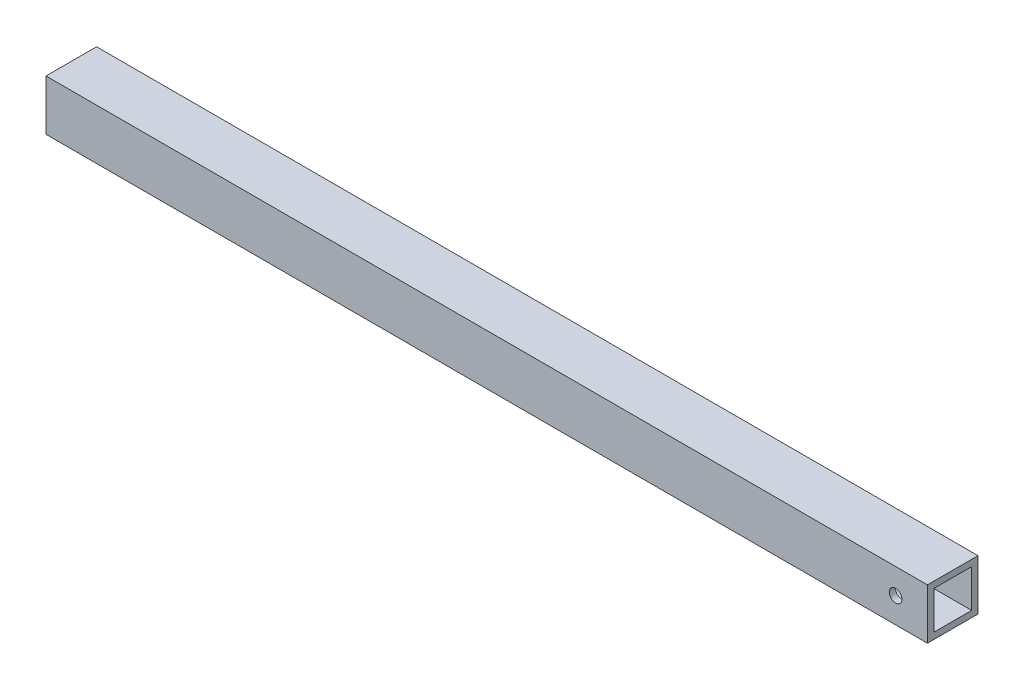
ISO-10303-21;
HEADER;
FILE_DESCRIPTION(('STEP AP214'),'2;1');
FILE_NAME('part.step','',(''),(''),'','','');
FILE_SCHEMA(('AUTOMOTIVE_DESIGN { 1 0 10303 214 1 1 1 1 }'));
ENDSEC;
DATA;
#1=APPLICATION_CONTEXT('core data for automotive mechanical design processes');
#2=APPLICATION_PROTOCOL_DEFINITION('international standard','automotive_design',2000,#1);
#3=PRODUCT_CONTEXT('',#1,'mechanical');
#4=PRODUCT('Part','Part','',(#3));
#5=PRODUCT_RELATED_PRODUCT_CATEGORY('part','',(#4));
#6=PRODUCT_DEFINITION_FORMATION('','',#4);
#7=PRODUCT_DEFINITION_CONTEXT('part definition',#1,'design');
#8=PRODUCT_DEFINITION('design','',#6,#7);
#9=PRODUCT_DEFINITION_SHAPE('','',#8);
#10=(LENGTH_UNIT() NAMED_UNIT(*) SI_UNIT(.MILLI.,.METRE.));
#11=(NAMED_UNIT(*) PLANE_ANGLE_UNIT() SI_UNIT($,.RADIAN.));
#12=(NAMED_UNIT(*) SI_UNIT($,.STERADIAN.) SOLID_ANGLE_UNIT());
#13=UNCERTAINTY_MEASURE_WITH_UNIT(LENGTH_MEASURE(1.E-05),#10,'distance_accuracy_value','');
#14=(GEOMETRIC_REPRESENTATION_CONTEXT(3) GLOBAL_UNCERTAINTY_ASSIGNED_CONTEXT((#13)) GLOBAL_UNIT_ASSIGNED_CONTEXT((#10,
#11,#12)) REPRESENTATION_CONTEXT('',''));
#15=CARTESIAN_POINT('',(0.,0.,0.));
#16=DIRECTION('',(0.,0.,1.));
#17=DIRECTION('',(1.,0.,0.));
#18=AXIS2_PLACEMENT_3D('',#15,#16,#17);
#19=CARTESIAN_POINT('',(-467.2,0.,-6.35));
#20=DIRECTION('',(0.,0.,1.));
#21=DIRECTION('',(0.,-1.,0.));
#22=AXIS2_PLACEMENT_3D('',#19,#20,#21);
#23=PLANE('',#22);
#24=CARTESIAN_POINT('',(-253.799125028571,3.79750000000007,-6.35));
#25=DIRECTION('',(0.,0.,1.));
#26=DIRECTION('',(0.,-1.,0.));
#27=AXIS2_PLACEMENT_3D('',#24,#25,#26);
#28=CIRCLE('',#27,1.59999999999999);
#29=CARTESIAN_POINT('',(-253.799125028571,2.19750000000008,-6.35));
#30=VERTEX_POINT('',#29);
#31=EDGE_CURVE('E135',#30,#30,#28,.T.);
#32=ORIENTED_EDGE('',*,*,#31,.T.);
#33=EDGE_LOOP('',(#32));
#34=FACE_BOUND('',#33,.T.);
#35=DIRECTION('',(0.,-1.,0.));
#36=VECTOR('',#35,1.);
#37=CARTESIAN_POINT('',(-245.799125028571,0.,-6.35));
#38=LINE('',#37,#36);
#39=CARTESIAN_POINT('',(-245.799125028571,10.1475000000001,-6.34999999999999));
#40=VERTEX_POINT('',#39);
#41=CARTESIAN_POINT('',(-245.799125028571,-2.55249999999993,-6.35));
#42=VERTEX_POINT('',#41);
#43=EDGE_CURVE('E144',#40,#42,#38,.T.);
#44=ORIENTED_EDGE('',*,*,#43,.T.);
#45=DIRECTION('',(1.,0.,0.));
#46=VECTOR('',#45,1.);
#47=CARTESIAN_POINT('',(-467.2,-2.55249999999993,-6.35));
#48=LINE('',#47,#46);
#49=CARTESIAN_POINT('',(-467.2,-2.55249999999993,-6.35));
#50=VERTEX_POINT('',#49);
#51=EDGE_CURVE('E11',#50,#42,#48,.T.);
#52=ORIENTED_EDGE('',*,*,#51,.F.);
#53=DIRECTION('',(0.,-1.,0.));
#54=VECTOR('',#53,1.);
#55=CARTESIAN_POINT('',(-467.2,0.,-6.35));
#56=LINE('',#55,#54);
#57=CARTESIAN_POINT('',(-467.2,10.1475000000001,-6.34999999999999));
#58=VERTEX_POINT('',#57);
#59=EDGE_CURVE('E56',#58,#50,#56,.T.);
#60=ORIENTED_EDGE('',*,*,#59,.F.);
#61=DIRECTION('',(1.,0.,0.));
#62=VECTOR('',#61,1.);
#63=CARTESIAN_POINT('',(-467.2,10.1475000000001,-6.34999999999999));
#64=LINE('',#63,#62);
#65=EDGE_CURVE('E118',#58,#40,#64,.T.);
#66=ORIENTED_EDGE('',*,*,#65,.T.);
#67=EDGE_LOOP('',(#44,#52,#60,#66));
#68=FACE_BOUND('',#67,.T.);
#69=ADVANCED_FACE('F37',(#34,#68),#23,.F.);
#70=CARTESIAN_POINT('',(-467.2,-2.55249999999993,0.));
#71=DIRECTION('',(0.,-1.,0.));
#72=DIRECTION('',(0.,0.,-1.));
#73=AXIS2_PLACEMENT_3D('',#70,#71,#72);
#74=PLANE('',#73);
#75=DIRECTION('',(0.,0.,-1.));
#76=VECTOR('',#75,1.);
#77=CARTESIAN_POINT('',(-245.799125028571,-2.55249999999993,0.));
#78=LINE('',#77,#76);
#79=CARTESIAN_POINT('',(-245.799125028571,-2.55249999999993,6.35));
#80=VERTEX_POINT('',#79);
#81=EDGE_CURVE('E149',#80,#42,#78,.T.);
#82=ORIENTED_EDGE('',*,*,#81,.F.);
#83=DIRECTION('',(1.,0.,0.));
#84=VECTOR('',#83,1.);
#85=CARTESIAN_POINT('',(-467.2,-2.55249999999993,6.35));
#86=LINE('',#85,#84);
#87=CARTESIAN_POINT('',(-467.2,-2.55249999999993,6.35));
#88=VERTEX_POINT('',#87);
#89=EDGE_CURVE('E47',#88,#80,#86,.T.);
#90=ORIENTED_EDGE('',*,*,#89,.F.);
#91=DIRECTION('',(0.,0.,-1.));
#92=VECTOR('',#91,1.);
#93=CARTESIAN_POINT('',(-467.2,-2.55249999999993,0.));
#94=LINE('',#93,#92);
#95=EDGE_CURVE('E126',#88,#50,#94,.T.);
#96=ORIENTED_EDGE('',*,*,#95,.T.);
#97=ORIENTED_EDGE('',*,*,#51,.T.);
#98=EDGE_LOOP('',(#82,#90,#96,#97));
#99=FACE_BOUND('',#98,.T.);
#100=ADVANCED_FACE('F212',(#99),#74,.T.);
#101=CARTESIAN_POINT('',(-467.2,0.,6.35));
#102=DIRECTION('',(0.,0.,1.));
#103=DIRECTION('',(0.,-1.,0.));
#104=AXIS2_PLACEMENT_3D('',#101,#102,#103);
#105=PLANE('',#104);
#106=CARTESIAN_POINT('',(-253.799125028571,3.79750000000007,6.35));
#107=DIRECTION('',(0.,0.,1.));
#108=DIRECTION('',(0.,-1.,0.));
#109=AXIS2_PLACEMENT_3D('',#106,#107,#108);
#110=CIRCLE('',#109,1.59999999999999);
#111=CARTESIAN_POINT('',(-253.799125028571,2.19750000000008,6.35));
#112=VERTEX_POINT('',#111);
#113=EDGE_CURVE('E189',#112,#112,#110,.T.);
#114=ORIENTED_EDGE('',*,*,#113,.F.);
#115=EDGE_LOOP('',(#114));
#116=FACE_BOUND('',#115,.T.);
#117=DIRECTION('',(0.,-1.,0.));
#118=VECTOR('',#117,1.);
#119=CARTESIAN_POINT('',(-245.799125028571,0.,6.35));
#120=LINE('',#119,#118);
#121=CARTESIAN_POINT('',(-245.799125028571,10.1475000000001,6.35000000000001));
#122=VERTEX_POINT('',#121);
#123=EDGE_CURVE('E115',#122,#80,#120,.T.);
#124=ORIENTED_EDGE('',*,*,#123,.F.);
#125=DIRECTION('',(1.,0.,0.));
#126=VECTOR('',#125,1.);
#127=CARTESIAN_POINT('',(-467.2,10.1475000000001,6.35000000000001));
#128=LINE('',#127,#126);
#129=CARTESIAN_POINT('',(-467.2,10.1475000000001,6.35000000000001));
#130=VERTEX_POINT('',#129);
#131=EDGE_CURVE('E110',#130,#122,#128,.T.);
#132=ORIENTED_EDGE('',*,*,#131,.F.);
#133=DIRECTION('',(0.,-1.,0.));
#134=VECTOR('',#133,1.);
#135=CARTESIAN_POINT('',(-467.2,0.,6.35));
#136=LINE('',#135,#134);
#137=EDGE_CURVE('E114',#130,#88,#136,.T.);
#138=ORIENTED_EDGE('',*,*,#137,.T.);
#139=ORIENTED_EDGE('',*,*,#89,.T.);
#140=EDGE_LOOP('',(#124,#132,#138,#139));
#141=FACE_BOUND('',#140,.T.);
#142=ADVANCED_FACE('F112',(#116,#141),#105,.T.);
#143=CARTESIAN_POINT('',(-467.2,0.,4.7625));
#144=DIRECTION('',(0.,0.,1.));
#145=DIRECTION('',(1.,0.,0.));
#146=AXIS2_PLACEMENT_3D('',#143,#144,#145);
#147=PLANE('',#146);
#148=CARTESIAN_POINT('',(-253.799125028571,3.79750000000007,4.7625));
#149=DIRECTION('',(0.,0.,1.));
#150=DIRECTION('',(1.,0.,0.));
#151=AXIS2_PLACEMENT_3D('',#148,#149,#150);
#152=CIRCLE('',#151,1.59999999999999);
#153=CARTESIAN_POINT('',(-252.199125028572,3.79750000000007,4.7625));
#154=VERTEX_POINT('',#153);
#155=EDGE_CURVE('E41',#154,#154,#152,.T.);
#156=ORIENTED_EDGE('',*,*,#155,.T.);
#157=EDGE_LOOP('',(#156));
#158=FACE_BOUND('',#157,.T.);
#159=DIRECTION('',(0.,-1.,0.));
#160=VECTOR('',#159,1.);
#161=CARTESIAN_POINT('',(-245.799125028571,0.,4.7625));
#162=LINE('',#161,#160);
#163=CARTESIAN_POINT('',(-245.799125028571,8.56000000000007,4.7625));
#164=VERTEX_POINT('',#163);
#165=CARTESIAN_POINT('',(-245.799125028571,-0.964999999999933,4.7625));
#166=VERTEX_POINT('',#165);
#167=EDGE_CURVE('E131',#164,#166,#162,.T.);
#168=ORIENTED_EDGE('',*,*,#167,.T.);
#169=DIRECTION('',(1.,0.,0.));
#170=VECTOR('',#169,1.);
#171=CARTESIAN_POINT('',(-467.2,-0.964999999999933,4.7625));
#172=LINE('',#171,#170);
#173=CARTESIAN_POINT('',(-467.2,-0.964999999999933,4.7625));
#174=VERTEX_POINT('',#173);
#175=EDGE_CURVE('E155',#174,#166,#172,.T.);
#176=ORIENTED_EDGE('',*,*,#175,.F.);
#177=DIRECTION('',(0.,-1.,0.));
#178=VECTOR('',#177,1.);
#179=CARTESIAN_POINT('',(-467.2,0.,4.7625));
#180=LINE('',#179,#178);
#181=CARTESIAN_POINT('',(-467.2,8.56000000000007,4.7625));
#182=VERTEX_POINT('',#181);
#183=EDGE_CURVE('E151',#182,#174,#180,.T.);
#184=ORIENTED_EDGE('',*,*,#183,.F.);
#185=DIRECTION('',(1.,0.,0.));
#186=VECTOR('',#185,1.);
#187=CARTESIAN_POINT('',(-467.2,8.56000000000007,4.7625));
#188=LINE('',#187,#186);
#189=EDGE_CURVE('E97',#182,#164,#188,.T.);
#190=ORIENTED_EDGE('',*,*,#189,.T.);
#191=EDGE_LOOP('',(#168,#176,#184,#190));
#192=FACE_BOUND('',#191,.T.);
#193=ADVANCED_FACE('F39',(#158,#192),#147,.F.);
#194=CARTESIAN_POINT('',(-467.2,-0.964999999999932,0.));
#195=DIRECTION('',(0.,-1.,0.));
#196=DIRECTION('',(0.,0.,-1.));
#197=AXIS2_PLACEMENT_3D('',#194,#195,#196);
#198=PLANE('',#197);
#199=DIRECTION('',(0.,0.,-1.));
#200=VECTOR('',#199,1.);
#201=CARTESIAN_POINT('',(-245.799125028571,-0.964999999999932,0.));
#202=LINE('',#201,#200);
#203=CARTESIAN_POINT('',(-245.799125028571,-0.964999999999932,-4.76250000000001));
#204=VERTEX_POINT('',#203);
#205=EDGE_CURVE('E141',#166,#204,#202,.T.);
#206=ORIENTED_EDGE('',*,*,#205,.T.);
#207=DIRECTION('',(1.,0.,0.));
#208=VECTOR('',#207,1.);
#209=CARTESIAN_POINT('',(-467.2,-0.964999999999932,-4.76250000000001));
#210=LINE('',#209,#208);
#211=CARTESIAN_POINT('',(-467.2,-0.964999999999932,-4.76250000000001));
#212=VERTEX_POINT('',#211);
#213=EDGE_CURVE('E158',#212,#204,#210,.T.);
#214=ORIENTED_EDGE('',*,*,#213,.F.);
#215=DIRECTION('',(0.,0.,-1.));
#216=VECTOR('',#215,1.);
#217=CARTESIAN_POINT('',(-467.2,-0.964999999999932,0.));
#218=LINE('',#217,#216);
#219=EDGE_CURVE('E180',#174,#212,#218,.T.);
#220=ORIENTED_EDGE('',*,*,#219,.F.);
#221=ORIENTED_EDGE('',*,*,#175,.T.);
#222=EDGE_LOOP('',(#206,#214,#220,#221));
#223=FACE_BOUND('',#222,.T.);
#224=ADVANCED_FACE('F179',(#223),#198,.F.);
#225=CARTESIAN_POINT('',(-467.2,0.,-4.76250000000001));
#226=DIRECTION('',(0.,0.,1.));
#227=DIRECTION('',(0.,-1.,0.));
#228=AXIS2_PLACEMENT_3D('',#225,#226,#227);
#229=PLANE('',#228);
#230=CARTESIAN_POINT('',(-253.799125028571,3.79750000000007,-4.76250000000001));
#231=DIRECTION('',(0.,0.,1.));
#232=DIRECTION('',(0.,-1.,0.));
#233=AXIS2_PLACEMENT_3D('',#230,#231,#232);
#234=CIRCLE('',#233,1.59999999999999);
#235=CARTESIAN_POINT('',(-253.799125028571,2.19750000000008,-4.76250000000001));
#236=VERTEX_POINT('',#235);
#237=EDGE_CURVE('E192',#236,#236,#234,.T.);
#238=ORIENTED_EDGE('',*,*,#237,.F.);
#239=EDGE_LOOP('',(#238));
#240=FACE_BOUND('',#239,.T.);
#241=DIRECTION('',(0.,-1.,0.));
#242=VECTOR('',#241,1.);
#243=CARTESIAN_POINT('',(-245.799125028571,0.,-4.76250000000001));
#244=LINE('',#243,#242);
#245=CARTESIAN_POINT('',(-245.799125028571,8.56000000000007,-4.7625));
#246=VERTEX_POINT('',#245);
#247=EDGE_CURVE('E138',#246,#204,#244,.T.);
#248=ORIENTED_EDGE('',*,*,#247,.F.);
#249=DIRECTION('',(1.,0.,0.));
#250=VECTOR('',#249,1.);
#251=CARTESIAN_POINT('',(-467.2,8.56000000000007,-4.7625));
#252=LINE('',#251,#250);
#253=CARTESIAN_POINT('',(-467.2,8.56000000000007,-4.7625));
#254=VERTEX_POINT('',#253);
#255=EDGE_CURVE('E160',#254,#246,#252,.T.);
#256=ORIENTED_EDGE('',*,*,#255,.F.);
#257=DIRECTION('',(0.,-1.,0.));
#258=VECTOR('',#257,1.);
#259=CARTESIAN_POINT('',(-467.2,0.,-4.76250000000001));
#260=LINE('',#259,#258);
#261=EDGE_CURVE('E177',#254,#212,#260,.T.);
#262=ORIENTED_EDGE('',*,*,#261,.T.);
#263=ORIENTED_EDGE('',*,*,#213,.T.);
#264=EDGE_LOOP('',(#248,#256,#262,#263));
#265=FACE_BOUND('',#264,.T.);
#266=ADVANCED_FACE('F175',(#240,#265),#229,.T.);
#267=CARTESIAN_POINT('',(-467.2,8.56000000000007,0.));
#268=DIRECTION('',(0.,-1.,0.));
#269=DIRECTION('',(0.,0.,-1.));
#270=AXIS2_PLACEMENT_3D('',#267,#268,#269);
#271=PLANE('',#270);
#272=DIRECTION('',(0.,0.,-1.));
#273=VECTOR('',#272,1.);
#274=CARTESIAN_POINT('',(-245.799125028571,8.56000000000007,0.));
#275=LINE('',#274,#273);
#276=EDGE_CURVE('E134',#164,#246,#275,.T.);
#277=ORIENTED_EDGE('',*,*,#276,.F.);
#278=ORIENTED_EDGE('',*,*,#189,.F.);
#279=DIRECTION('',(0.,0.,-1.));
#280=VECTOR('',#279,1.);
#281=CARTESIAN_POINT('',(-467.2,8.56000000000007,0.));
#282=LINE('',#281,#280);
#283=EDGE_CURVE('E171',#182,#254,#282,.T.);
#284=ORIENTED_EDGE('',*,*,#283,.T.);
#285=ORIENTED_EDGE('',*,*,#255,.T.);
#286=EDGE_LOOP('',(#277,#278,#284,#285));
#287=FACE_BOUND('',#286,.T.);
#288=ADVANCED_FACE('F169',(#287),#271,.T.);
#289=CARTESIAN_POINT('',(-467.2,10.1475000000001,0.));
#290=DIRECTION('',(0.,-1.,0.));
#291=DIRECTION('',(0.,0.,-1.));
#292=AXIS2_PLACEMENT_3D('',#289,#290,#291);
#293=PLANE('',#292);
#294=DIRECTION('',(0.,0.,-1.));
#295=VECTOR('',#294,1.);
#296=CARTESIAN_POINT('',(-245.799125028571,10.1475000000001,0.));
#297=LINE('',#296,#295);
#298=EDGE_CURVE('E146',#122,#40,#297,.T.);
#299=ORIENTED_EDGE('',*,*,#298,.T.);
#300=ORIENTED_EDGE('',*,*,#65,.F.);
#301=DIRECTION('',(0.,0.,-1.));
#302=VECTOR('',#301,1.);
#303=CARTESIAN_POINT('',(-467.2,10.1475000000001,0.));
#304=LINE('',#303,#302);
#305=EDGE_CURVE('E121',#130,#58,#304,.T.);
#306=ORIENTED_EDGE('',*,*,#305,.F.);
#307=ORIENTED_EDGE('',*,*,#131,.T.);
#308=EDGE_LOOP('',(#299,#300,#306,#307));
#309=FACE_BOUND('',#308,.T.);
#310=ADVANCED_FACE('F122',(#309),#293,.F.);
#311=CARTESIAN_POINT('',(-467.2,0.,0.));
#312=DIRECTION('',(1.,0.,0.));
#313=DIRECTION('',(0.,0.,-1.));
#314=AXIS2_PLACEMENT_3D('',#311,#312,#313);
#315=PLANE('',#314);
#316=ORIENTED_EDGE('',*,*,#183,.T.);
#317=ORIENTED_EDGE('',*,*,#219,.T.);
#318=ORIENTED_EDGE('',*,*,#261,.F.);
#319=ORIENTED_EDGE('',*,*,#283,.F.);
#320=EDGE_LOOP('',(#316,#317,#318,#319));
#321=FACE_BOUND('',#320,.T.);
#322=ORIENTED_EDGE('',*,*,#59,.T.);
#323=ORIENTED_EDGE('',*,*,#95,.F.);
#324=ORIENTED_EDGE('',*,*,#137,.F.);
#325=ORIENTED_EDGE('',*,*,#305,.T.);
#326=EDGE_LOOP('',(#322,#323,#324,#325));
#327=FACE_BOUND('',#326,.T.);
#328=ADVANCED_FACE('F125',(#321,#327),#315,.F.);
#329=CARTESIAN_POINT('',(-245.799125028571,0.,0.));
#330=DIRECTION('',(1.,0.,0.));
#331=DIRECTION('',(0.,0.,-1.));
#332=AXIS2_PLACEMENT_3D('',#329,#330,#331);
#333=PLANE('',#332);
#334=ORIENTED_EDGE('',*,*,#167,.F.);
#335=ORIENTED_EDGE('',*,*,#276,.T.);
#336=ORIENTED_EDGE('',*,*,#247,.T.);
#337=ORIENTED_EDGE('',*,*,#205,.F.);
#338=EDGE_LOOP('',(#334,#335,#336,#337));
#339=FACE_BOUND('',#338,.T.);
#340=ORIENTED_EDGE('',*,*,#43,.F.);
#341=ORIENTED_EDGE('',*,*,#298,.F.);
#342=ORIENTED_EDGE('',*,*,#123,.T.);
#343=ORIENTED_EDGE('',*,*,#81,.T.);
#344=EDGE_LOOP('',(#340,#341,#342,#343));
#345=FACE_BOUND('',#344,.T.);
#346=ADVANCED_FACE('F167',(#339,#345),#333,.T.);
#347=CARTESIAN_POINT('',(-253.799125028571,3.79750000000008,-10.9625));
#348=DIRECTION('',(0.,0.,-1.));
#349=DIRECTION('',(0.,1.,0.));
#350=AXIS2_PLACEMENT_3D('',#347,#348,#349);
#351=CYLINDRICAL_SURFACE('',#350,1.59999999999999);
#352=ORIENTED_EDGE('',*,*,#113,.T.);
#353=EDGE_LOOP('',(#352));
#354=FACE_BOUND('',#353,.T.);
#355=ORIENTED_EDGE('',*,*,#155,.F.);
#356=EDGE_LOOP('',(#355));
#357=FACE_BOUND('',#356,.T.);
#358=ADVANCED_FACE('F200',(#354,#357),#351,.F.);
#359=ORIENTED_EDGE('',*,*,#237,.T.);
#360=EDGE_LOOP('',(#359));
#361=FACE_BOUND('',#360,.T.);
#362=ORIENTED_EDGE('',*,*,#31,.F.);
#363=EDGE_LOOP('',(#362));
#364=FACE_BOUND('',#363,.T.);
#365=ADVANCED_FACE('F202',(#361,#364),#351,.F.);
#366=CLOSED_SHELL('',(#69,#100,#142,#193,#224,#266,#288,#310,#328,#346,#358,#365));
#367=MANIFOLD_SOLID_BREP('B2',#366);
#368=ADVANCED_BREP_SHAPE_REPRESENTATION('',(#18,#367),#14);
#369=SHAPE_DEFINITION_REPRESENTATION(#9,#368);
ENDSEC;
END-ISO-10303-21;
